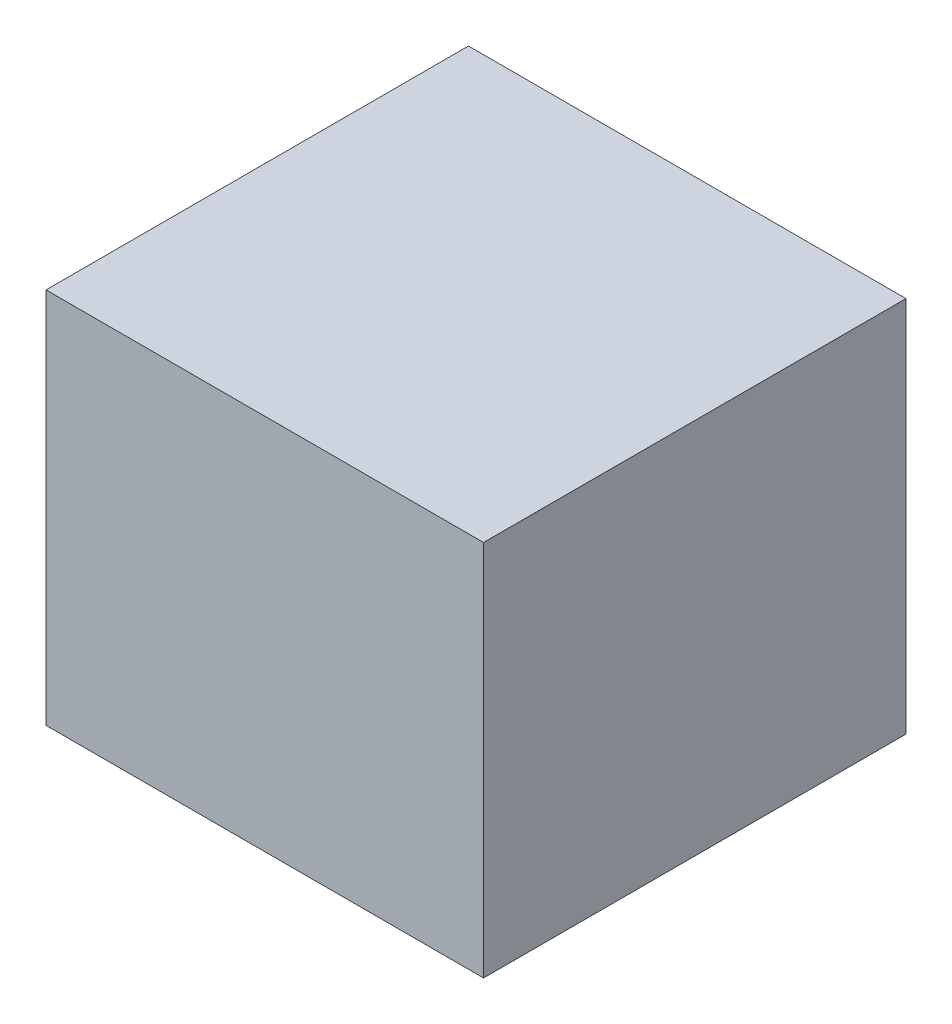
ISO-10303-21;
HEADER;
FILE_DESCRIPTION(('STEP AP214'),'2;1');
FILE_NAME('part.step','',(''),(''),'','','');
FILE_SCHEMA(('AUTOMOTIVE_DESIGN { 1 0 10303 214 1 1 1 1 }'));
ENDSEC;
DATA;
#1=APPLICATION_CONTEXT('core data for automotive mechanical design processes');
#2=APPLICATION_PROTOCOL_DEFINITION('international standard','automotive_design',2000,#1);
#3=PRODUCT_CONTEXT('',#1,'mechanical');
#4=PRODUCT('Part','Part','',(#3));
#5=PRODUCT_RELATED_PRODUCT_CATEGORY('part','',(#4));
#6=PRODUCT_DEFINITION_FORMATION('','',#4);
#7=PRODUCT_DEFINITION_CONTEXT('part definition',#1,'design');
#8=PRODUCT_DEFINITION('design','',#6,#7);
#9=PRODUCT_DEFINITION_SHAPE('','',#8);
#10=(LENGTH_UNIT() NAMED_UNIT(*) SI_UNIT(.MILLI.,.METRE.));
#11=(NAMED_UNIT(*) PLANE_ANGLE_UNIT() SI_UNIT($,.RADIAN.));
#12=(NAMED_UNIT(*) SI_UNIT($,.STERADIAN.) SOLID_ANGLE_UNIT());
#13=UNCERTAINTY_MEASURE_WITH_UNIT(LENGTH_MEASURE(1.E-05),#10,'distance_accuracy_value','');
#14=(GEOMETRIC_REPRESENTATION_CONTEXT(3) GLOBAL_UNCERTAINTY_ASSIGNED_CONTEXT((#13)) GLOBAL_UNIT_ASSIGNED_CONTEXT((#10,
#11,#12)) REPRESENTATION_CONTEXT('',''));
#15=CARTESIAN_POINT('',(0.,0.,0.));
#16=DIRECTION('',(0.,0.,1.));
#17=DIRECTION('',(1.,0.,0.));
#18=AXIS2_PLACEMENT_3D('',#15,#16,#17);
#19=CARTESIAN_POINT('',(0.,0.,1.39999974));
#20=DIRECTION('',(0.,0.,-1.));
#21=DIRECTION('',(0.,-1.,0.));
#22=AXIS2_PLACEMENT_3D('',#19,#20,#21);
#23=PLANE('',#22);
#24=DIRECTION('',(0.,1.,0.));
#25=VECTOR('',#24,1.);
#26=CARTESIAN_POINT('',(-0.72499982,-0.62500002,1.39999974));
#27=LINE('',#26,#25);
#28=CARTESIAN_POINT('',(-0.72499982,-0.62500002,1.39999974));
#29=VERTEX_POINT('',#28);
#30=CARTESIAN_POINT('',(-0.72499982,0.62500002,1.39999974));
#31=VERTEX_POINT('',#30);
#32=EDGE_CURVE('E26',#29,#31,#27,.T.);
#33=ORIENTED_EDGE('',*,*,#32,.F.);
#34=DIRECTION('',(-1.,0.,0.));
#35=VECTOR('',#34,1.);
#36=CARTESIAN_POINT('',(0.72499982,-0.62500002,1.39999974));
#37=LINE('',#36,#35);
#38=CARTESIAN_POINT('',(0.72499982,-0.62500002,1.39999974));
#39=VERTEX_POINT('',#38);
#40=EDGE_CURVE('E83',#39,#29,#37,.T.);
#41=ORIENTED_EDGE('',*,*,#40,.F.);
#42=DIRECTION('',(0.,-1.,0.));
#43=VECTOR('',#42,1.);
#44=CARTESIAN_POINT('',(0.72499982,0.62500002,1.39999974));
#45=LINE('',#44,#43);
#46=CARTESIAN_POINT('',(0.72499982,0.62500002,1.39999974));
#47=VERTEX_POINT('',#46);
#48=EDGE_CURVE('E86',#47,#39,#45,.T.);
#49=ORIENTED_EDGE('',*,*,#48,.F.);
#50=DIRECTION('',(1.,0.,0.));
#51=VECTOR('',#50,1.);
#52=CARTESIAN_POINT('',(-0.72499982,0.62500002,1.39999974));
#53=LINE('',#52,#51);
#54=EDGE_CURVE('E106',#31,#47,#53,.T.);
#55=ORIENTED_EDGE('',*,*,#54,.F.);
#56=EDGE_LOOP('',(#33,#41,#49,#55));
#57=FACE_BOUND('',#56,.T.);
#58=ADVANCED_FACE('F17',(#57),#23,.F.);
#59=CARTESIAN_POINT('',(0.,0.,0.));
#60=DIRECTION('',(0.,0.,-1.));
#61=DIRECTION('',(0.,-1.,0.));
#62=AXIS2_PLACEMENT_3D('',#59,#60,#61);
#63=PLANE('',#62);
#64=DIRECTION('',(1.,0.,0.));
#65=VECTOR('',#64,1.);
#66=CARTESIAN_POINT('',(-0.72499982,0.62500002,0.));
#67=LINE('',#66,#65);
#68=CARTESIAN_POINT('',(-0.72499982,0.62500002,0.));
#69=VERTEX_POINT('',#68);
#70=CARTESIAN_POINT('',(0.72499982,0.62500002,0.));
#71=VERTEX_POINT('',#70);
#72=EDGE_CURVE('E78',#69,#71,#67,.T.);
#73=ORIENTED_EDGE('',*,*,#72,.T.);
#74=DIRECTION('',(0.,-1.,0.));
#75=VECTOR('',#74,1.);
#76=CARTESIAN_POINT('',(0.72499982,0.62500002,0.));
#77=LINE('',#76,#75);
#78=CARTESIAN_POINT('',(0.72499982,-0.62500002,0.));
#79=VERTEX_POINT('',#78);
#80=EDGE_CURVE('E75',#71,#79,#77,.T.);
#81=ORIENTED_EDGE('',*,*,#80,.T.);
#82=DIRECTION('',(-1.,0.,0.));
#83=VECTOR('',#82,1.);
#84=CARTESIAN_POINT('',(0.72499982,-0.62500002,0.));
#85=LINE('',#84,#83);
#86=CARTESIAN_POINT('',(-0.72499982,-0.62500002,0.));
#87=VERTEX_POINT('',#86);
#88=EDGE_CURVE('E64',#79,#87,#85,.T.);
#89=ORIENTED_EDGE('',*,*,#88,.T.);
#90=DIRECTION('',(0.,1.,0.));
#91=VECTOR('',#90,1.);
#92=CARTESIAN_POINT('',(-0.72499982,-0.62500002,0.));
#93=LINE('',#92,#91);
#94=EDGE_CURVE('E11',#87,#69,#93,.T.);
#95=ORIENTED_EDGE('',*,*,#94,.T.);
#96=EDGE_LOOP('',(#73,#81,#89,#95));
#97=FACE_BOUND('',#96,.T.);
#98=ADVANCED_FACE('F76',(#97),#63,.T.);
#99=CARTESIAN_POINT('',(-0.72499982,-0.62500002,0.));
#100=DIRECTION('',(-1.,0.,0.));
#101=DIRECTION('',(0.,0.,1.));
#102=AXIS2_PLACEMENT_3D('',#99,#100,#101);
#103=PLANE('',#102);
#104=DIRECTION('',(0.,0.,1.));
#105=VECTOR('',#104,1.);
#106=CARTESIAN_POINT('',(-0.72499982,-0.62500002,0.));
#107=LINE('',#106,#105);
#108=EDGE_CURVE('E71',#87,#29,#107,.T.);
#109=ORIENTED_EDGE('',*,*,#108,.T.);
#110=ORIENTED_EDGE('',*,*,#32,.T.);
#111=DIRECTION('',(0.,0.,1.));
#112=VECTOR('',#111,1.);
#113=CARTESIAN_POINT('',(-0.72499982,0.62500002,0.));
#114=LINE('',#113,#112);
#115=EDGE_CURVE('E103',#69,#31,#114,.T.);
#116=ORIENTED_EDGE('',*,*,#115,.F.);
#117=ORIENTED_EDGE('',*,*,#94,.F.);
#118=EDGE_LOOP('',(#109,#110,#116,#117));
#119=FACE_BOUND('',#118,.T.);
#120=ADVANCED_FACE('F121',(#119),#103,.T.);
#121=CARTESIAN_POINT('',(0.72499982,-0.62500002,0.));
#122=DIRECTION('',(0.,-1.,0.));
#123=DIRECTION('',(0.,0.,-1.));
#124=AXIS2_PLACEMENT_3D('',#121,#122,#123);
#125=PLANE('',#124);
#126=DIRECTION('',(0.,0.,1.));
#127=VECTOR('',#126,1.);
#128=CARTESIAN_POINT('',(0.72499982,-0.62500002,0.));
#129=LINE('',#128,#127);
#130=EDGE_CURVE('E69',#79,#39,#129,.T.);
#131=ORIENTED_EDGE('',*,*,#130,.T.);
#132=ORIENTED_EDGE('',*,*,#40,.T.);
#133=ORIENTED_EDGE('',*,*,#108,.F.);
#134=ORIENTED_EDGE('',*,*,#88,.F.);
#135=EDGE_LOOP('',(#131,#132,#133,#134));
#136=FACE_BOUND('',#135,.T.);
#137=ADVANCED_FACE('F66',(#136),#125,.T.);
#138=CARTESIAN_POINT('',(0.72499982,0.62500002,0.));
#139=DIRECTION('',(1.,0.,0.));
#140=DIRECTION('',(0.,1.,0.));
#141=AXIS2_PLACEMENT_3D('',#138,#139,#140);
#142=PLANE('',#141);
#143=DIRECTION('',(0.,0.,1.));
#144=VECTOR('',#143,1.);
#145=CARTESIAN_POINT('',(0.72499982,0.62500002,0.));
#146=LINE('',#145,#144);
#147=EDGE_CURVE('E111',#71,#47,#146,.T.);
#148=ORIENTED_EDGE('',*,*,#147,.T.);
#149=ORIENTED_EDGE('',*,*,#48,.T.);
#150=ORIENTED_EDGE('',*,*,#130,.F.);
#151=ORIENTED_EDGE('',*,*,#80,.F.);
#152=EDGE_LOOP('',(#148,#149,#150,#151));
#153=FACE_BOUND('',#152,.T.);
#154=ADVANCED_FACE('F85',(#153),#142,.T.);
#155=CARTESIAN_POINT('',(-0.72499982,0.62500002,0.));
#156=DIRECTION('',(0.,1.,0.));
#157=DIRECTION('',(1.,0.,0.));
#158=AXIS2_PLACEMENT_3D('',#155,#156,#157);
#159=PLANE('',#158);
#160=ORIENTED_EDGE('',*,*,#115,.T.);
#161=ORIENTED_EDGE('',*,*,#54,.T.);
#162=ORIENTED_EDGE('',*,*,#147,.F.);
#163=ORIENTED_EDGE('',*,*,#72,.F.);
#164=EDGE_LOOP('',(#160,#161,#162,#163));
#165=FACE_BOUND('',#164,.T.);
#166=ADVANCED_FACE('F119',(#165),#159,.T.);
#167=CLOSED_SHELL('',(#58,#98,#120,#137,#154,#166));
#168=MANIFOLD_SOLID_BREP('B1',#167);
#169=ADVANCED_BREP_SHAPE_REPRESENTATION('',(#18,#168),#14);
#170=SHAPE_DEFINITION_REPRESENTATION(#9,#169);
ENDSEC;
END-ISO-10303-21;
